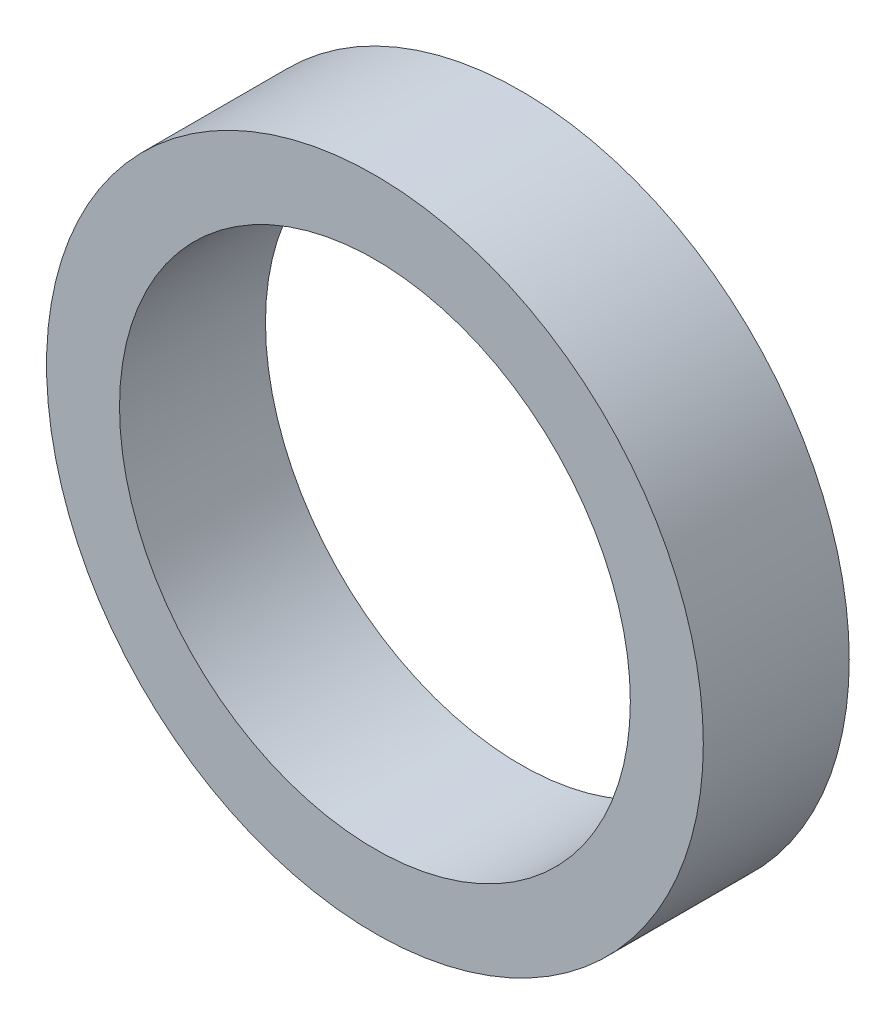
ISO-10303-21;
HEADER;
FILE_DESCRIPTION(('STEP AP214'),'2;1');
FILE_NAME('part.step','',(''),(''),'','','');
FILE_SCHEMA(('AUTOMOTIVE_DESIGN { 1 0 10303 214 1 1 1 1 }'));
ENDSEC;
DATA;
#1=APPLICATION_CONTEXT('core data for automotive mechanical design processes');
#2=APPLICATION_PROTOCOL_DEFINITION('international standard','automotive_design',2000,#1);
#3=PRODUCT_CONTEXT('',#1,'mechanical');
#4=PRODUCT('Part','Part','',(#3));
#5=PRODUCT_RELATED_PRODUCT_CATEGORY('part','',(#4));
#6=PRODUCT_DEFINITION_FORMATION('','',#4);
#7=PRODUCT_DEFINITION_CONTEXT('part definition',#1,'design');
#8=PRODUCT_DEFINITION('design','',#6,#7);
#9=PRODUCT_DEFINITION_SHAPE('','',#8);
#10=(LENGTH_UNIT() NAMED_UNIT(*) SI_UNIT(.MILLI.,.METRE.));
#11=(NAMED_UNIT(*) PLANE_ANGLE_UNIT() SI_UNIT($,.RADIAN.));
#12=(NAMED_UNIT(*) SI_UNIT($,.STERADIAN.) SOLID_ANGLE_UNIT());
#13=UNCERTAINTY_MEASURE_WITH_UNIT(LENGTH_MEASURE(1.E-05),#10,'distance_accuracy_value','');
#14=(GEOMETRIC_REPRESENTATION_CONTEXT(3) GLOBAL_UNCERTAINTY_ASSIGNED_CONTEXT((#13)) GLOBAL_UNIT_ASSIGNED_CONTEXT((#10,
#11,#12)) REPRESENTATION_CONTEXT('',''));
#15=CARTESIAN_POINT('',(0.,0.,0.));
#16=DIRECTION('',(0.,0.,1.));
#17=DIRECTION('',(1.,0.,0.));
#18=AXIS2_PLACEMENT_3D('',#15,#16,#17);
#19=CARTESIAN_POINT('',(0.,0.,8.));
#20=DIRECTION('',(0.,0.,1.));
#21=DIRECTION('',(1.,0.,0.));
#22=AXIS2_PLACEMENT_3D('',#19,#20,#21);
#23=PLANE('',#22);
#24=CARTESIAN_POINT('',(0.,0.,8.));
#25=DIRECTION('',(0.,0.,1.));
#26=DIRECTION('',(1.,0.,0.));
#27=AXIS2_PLACEMENT_3D('',#24,#25,#26);
#28=CIRCLE('',#27,18.);
#29=CARTESIAN_POINT('',(18.,0.,8.));
#30=VERTEX_POINT('',#29);
#31=EDGE_CURVE('E10',#30,#30,#28,.T.);
#32=ORIENTED_EDGE('',*,*,#31,.T.);
#33=EDGE_LOOP('',(#32));
#34=FACE_BOUND('',#33,.T.);
#35=CARTESIAN_POINT('',(0.,0.,8.));
#36=DIRECTION('',(0.,0.,1.));
#37=DIRECTION('',(1.,0.,0.));
#38=AXIS2_PLACEMENT_3D('',#35,#36,#37);
#39=CIRCLE('',#38,14.);
#40=CARTESIAN_POINT('',(14.,0.,8.));
#41=VERTEX_POINT('',#40);
#42=EDGE_CURVE('E56',#41,#41,#39,.T.);
#43=ORIENTED_EDGE('',*,*,#42,.F.);
#44=EDGE_LOOP('',(#43));
#45=FACE_BOUND('',#44,.T.);
#46=ADVANCED_FACE('F43',(#34,#45),#23,.T.);
#47=CARTESIAN_POINT('',(0.,0.,0.));
#48=DIRECTION('',(0.,0.,1.));
#49=DIRECTION('',(1.,0.,0.));
#50=AXIS2_PLACEMENT_3D('',#47,#48,#49);
#51=PLANE('',#50);
#52=CARTESIAN_POINT('',(0.,0.,0.));
#53=DIRECTION('',(0.,0.,1.));
#54=DIRECTION('',(1.,0.,0.));
#55=AXIS2_PLACEMENT_3D('',#52,#53,#54);
#56=CIRCLE('',#55,18.);
#57=CARTESIAN_POINT('',(18.,0.,0.));
#58=VERTEX_POINT('',#57);
#59=EDGE_CURVE('E47',#58,#58,#56,.T.);
#60=ORIENTED_EDGE('',*,*,#59,.F.);
#61=EDGE_LOOP('',(#60));
#62=FACE_BOUND('',#61,.T.);
#63=CARTESIAN_POINT('',(0.,0.,0.));
#64=DIRECTION('',(0.,0.,1.));
#65=DIRECTION('',(1.,0.,0.));
#66=AXIS2_PLACEMENT_3D('',#63,#64,#65);
#67=CIRCLE('',#66,14.);
#68=CARTESIAN_POINT('',(14.,0.,0.));
#69=VERTEX_POINT('',#68);
#70=EDGE_CURVE('E58',#69,#69,#67,.T.);
#71=ORIENTED_EDGE('',*,*,#70,.T.);
#72=EDGE_LOOP('',(#71));
#73=FACE_BOUND('',#72,.T.);
#74=ADVANCED_FACE('F70',(#62,#73),#51,.F.);
#75=CARTESIAN_POINT('',(0.,0.,8.));
#76=DIRECTION('',(0.,0.,-1.));
#77=DIRECTION('',(-1.,0.,0.));
#78=AXIS2_PLACEMENT_3D('',#75,#76,#77);
#79=CYLINDRICAL_SURFACE('',#78,18.);
#80=ORIENTED_EDGE('',*,*,#31,.F.);
#81=EDGE_LOOP('',(#80));
#82=FACE_BOUND('',#81,.T.);
#83=ORIENTED_EDGE('',*,*,#59,.T.);
#84=EDGE_LOOP('',(#83));
#85=FACE_BOUND('',#84,.T.);
#86=ADVANCED_FACE('F45',(#82,#85),#79,.T.);
#87=CARTESIAN_POINT('',(0.,0.,8.));
#88=DIRECTION('',(0.,0.,-1.));
#89=DIRECTION('',(-1.,0.,0.));
#90=AXIS2_PLACEMENT_3D('',#87,#88,#89);
#91=CYLINDRICAL_SURFACE('',#90,14.);
#92=ORIENTED_EDGE('',*,*,#42,.T.);
#93=EDGE_LOOP('',(#92));
#94=FACE_BOUND('',#93,.T.);
#95=ORIENTED_EDGE('',*,*,#70,.F.);
#96=EDGE_LOOP('',(#95));
#97=FACE_BOUND('',#96,.T.);
#98=ADVANCED_FACE('F66',(#94,#97),#91,.F.);
#99=CLOSED_SHELL('',(#46,#74,#86,#98));
#100=MANIFOLD_SOLID_BREP('B2',#99);
#101=ADVANCED_BREP_SHAPE_REPRESENTATION('',(#18,#100),#14);
#102=SHAPE_DEFINITION_REPRESENTATION(#9,#101);
ENDSEC;
END-ISO-10303-21;
